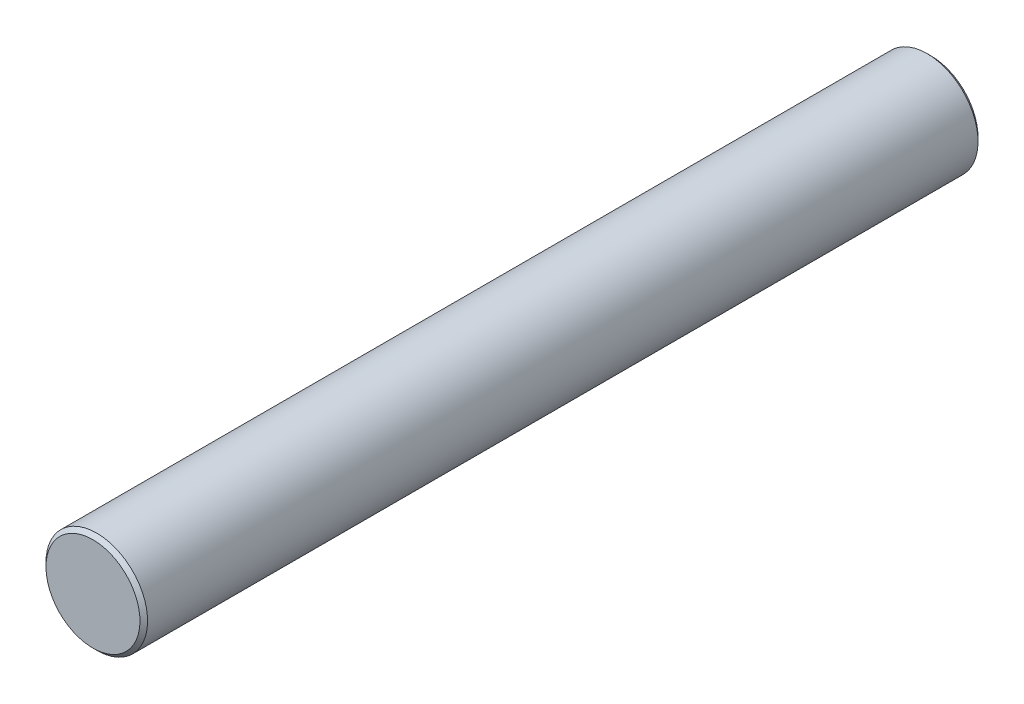
ISO-10303-21;
HEADER;
FILE_DESCRIPTION(('STEP AP214'),'2;1');
FILE_NAME('part.step','',(''),(''),'','','');
FILE_SCHEMA(('AUTOMOTIVE_DESIGN { 1 0 10303 214 1 1 1 1 }'));
ENDSEC;
DATA;
#1=APPLICATION_CONTEXT('core data for automotive mechanical design processes');
#2=APPLICATION_PROTOCOL_DEFINITION('international standard','automotive_design',2000,#1);
#3=PRODUCT_CONTEXT('',#1,'mechanical');
#4=PRODUCT('Part','Part','',(#3));
#5=PRODUCT_RELATED_PRODUCT_CATEGORY('part','',(#4));
#6=PRODUCT_DEFINITION_FORMATION('','',#4);
#7=PRODUCT_DEFINITION_CONTEXT('part definition',#1,'design');
#8=PRODUCT_DEFINITION('design','',#6,#7);
#9=PRODUCT_DEFINITION_SHAPE('','',#8);
#10=(LENGTH_UNIT() NAMED_UNIT(*) SI_UNIT(.MILLI.,.METRE.));
#11=(NAMED_UNIT(*) PLANE_ANGLE_UNIT() SI_UNIT($,.RADIAN.));
#12=(NAMED_UNIT(*) SI_UNIT($,.STERADIAN.) SOLID_ANGLE_UNIT());
#13=UNCERTAINTY_MEASURE_WITH_UNIT(LENGTH_MEASURE(1.E-05),#10,'distance_accuracy_value','');
#14=(GEOMETRIC_REPRESENTATION_CONTEXT(3) GLOBAL_UNCERTAINTY_ASSIGNED_CONTEXT((#13)) GLOBAL_UNIT_ASSIGNED_CONTEXT((#10,
#11,#12)) REPRESENTATION_CONTEXT('',''));
#15=CARTESIAN_POINT('',(0.,0.,0.));
#16=DIRECTION('',(0.,0.,1.));
#17=DIRECTION('',(1.,0.,0.));
#18=AXIS2_PLACEMENT_3D('',#15,#16,#17);
#19=CARTESIAN_POINT('',(0.,9.25,0.));
#20=DIRECTION('',(0.,0.,-1.));
#21=DIRECTION('',(0.,1.,0.));
#22=AXIS2_PLACEMENT_3D('',#19,#20,#21);
#23=PLANE('',#22);
#24=CARTESIAN_POINT('',(0.,0.,0.));
#25=DIRECTION('',(0.,0.,-1.));
#26=DIRECTION('',(0.,1.,0.));
#27=AXIS2_PLACEMENT_3D('',#24,#25,#26);
#28=CIRCLE('',#27,18.5);
#29=CARTESIAN_POINT('',(0.,18.5,0.));
#30=VERTEX_POINT('',#29);
#31=EDGE_CURVE('E9',#30,#30,#28,.T.);
#32=ORIENTED_EDGE('',*,*,#31,.T.);
#33=EDGE_LOOP('',(#32));
#34=FACE_BOUND('',#33,.T.);
#35=CARTESIAN_POINT('',(0.,0.,0.));
#36=DIRECTION('',(0.,0.,1.));
#37=DIRECTION('',(-1.,0.,0.));
#38=AXIS2_PLACEMENT_3D('',#35,#36,#37);
#39=CIRCLE('',#38,6.);
#40=CARTESIAN_POINT('',(-6.,0.,0.));
#41=VERTEX_POINT('',#40);
#42=EDGE_CURVE('E52',#41,#41,#39,.T.);
#43=ORIENTED_EDGE('',*,*,#42,.T.);
#44=EDGE_LOOP('',(#43));
#45=FACE_BOUND('',#44,.T.);
#46=ADVANCED_FACE('F15',(#34,#45),#23,.T.);
#47=CARTESIAN_POINT('',(0.,0.,0.75));
#48=DIRECTION('',(0.,0.,1.));
#49=DIRECTION('',(0.,1.,0.));
#50=AXIS2_PLACEMENT_3D('',#47,#48,#49);
#51=CONICAL_SURFACE('',#50,19.25,0.785398163397448);
#52=CARTESIAN_POINT('',(0.,0.,1.5));
#53=DIRECTION('',(0.,0.,-1.));
#54=DIRECTION('',(0.,1.,0.));
#55=AXIS2_PLACEMENT_3D('',#52,#53,#54);
#56=CIRCLE('',#55,20.);
#57=CARTESIAN_POINT('',(0.,20.,1.5));
#58=VERTEX_POINT('',#57);
#59=EDGE_CURVE('E25',#58,#58,#56,.T.);
#60=ORIENTED_EDGE('',*,*,#59,.T.);
#61=EDGE_LOOP('',(#60));
#62=FACE_BOUND('',#61,.T.);
#63=ORIENTED_EDGE('',*,*,#31,.F.);
#64=EDGE_LOOP('',(#63));
#65=FACE_BOUND('',#64,.T.);
#66=ADVANCED_FACE('F121',(#62,#65),#51,.T.);
#67=CARTESIAN_POINT('',(0.,0.,165.));
#68=DIRECTION('',(0.,0.,1.));
#69=DIRECTION('',(0.,1.,0.));
#70=AXIS2_PLACEMENT_3D('',#67,#68,#69);
#71=CYLINDRICAL_SURFACE('',#70,20.);
#72=CARTESIAN_POINT('',(0.,0.,328.5));
#73=DIRECTION('',(0.,0.,-1.));
#74=DIRECTION('',(0.,1.,0.));
#75=AXIS2_PLACEMENT_3D('',#72,#73,#74);
#76=CIRCLE('',#75,20.);
#77=CARTESIAN_POINT('',(0.,20.,328.5));
#78=VERTEX_POINT('',#77);
#79=EDGE_CURVE('E19',#78,#78,#76,.T.);
#80=ORIENTED_EDGE('',*,*,#79,.T.);
#81=EDGE_LOOP('',(#80));
#82=FACE_BOUND('',#81,.T.);
#83=ORIENTED_EDGE('',*,*,#59,.F.);
#84=EDGE_LOOP('',(#83));
#85=FACE_BOUND('',#84,.T.);
#86=CARTESIAN_POINT('',(0.,0.,6.5));
#87=DIRECTION('',(0.,0.,-1.));
#88=DIRECTION('',(0.,1.,0.));
#89=AXIS2_PLACEMENT_3D('',#86,#87,#88);
#90=CIRCLE('',#89,20.);
#91=CARTESIAN_POINT('',(10.5356537528527,-17.,6.5));
#92=VERTEX_POINT('',#91);
#93=CARTESIAN_POINT('',(-10.5356537528527,-17.,6.5));
#94=VERTEX_POINT('',#93);
#95=EDGE_CURVE('E69',#92,#94,#90,.T.);
#96=ORIENTED_EDGE('',*,*,#95,.T.);
#97=DIRECTION('',(0.,0.,1.));
#98=VECTOR('',#97,1.);
#99=CARTESIAN_POINT('',(-10.5356537528527,-17.,8.25));
#100=LINE('',#99,#98);
#101=CARTESIAN_POINT('',(-10.5356537528527,-17.,10.));
#102=VERTEX_POINT('',#101);
#103=EDGE_CURVE('E62',#94,#102,#100,.T.);
#104=ORIENTED_EDGE('',*,*,#103,.T.);
#105=CARTESIAN_POINT('',(0.,0.,10.));
#106=DIRECTION('',(0.,0.,1.));
#107=DIRECTION('',(0.,1.,0.));
#108=AXIS2_PLACEMENT_3D('',#105,#106,#107);
#109=CIRCLE('',#108,20.);
#110=CARTESIAN_POINT('',(10.5356537528527,-17.,10.));
#111=VERTEX_POINT('',#110);
#112=EDGE_CURVE('E75',#102,#111,#109,.T.);
#113=ORIENTED_EDGE('',*,*,#112,.T.);
#114=DIRECTION('',(0.,0.,-1.));
#115=VECTOR('',#114,1.);
#116=CARTESIAN_POINT('',(10.5356537528527,-17.,8.25));
#117=LINE('',#116,#115);
#118=EDGE_CURVE('E60',#111,#92,#117,.T.);
#119=ORIENTED_EDGE('',*,*,#118,.T.);
#120=EDGE_LOOP('',(#96,#104,#113,#119));
#121=FACE_BOUND('',#120,.T.);
#122=ADVANCED_FACE('F17',(#82,#85,#121),#71,.T.);
#123=CARTESIAN_POINT('',(0.,0.,329.25));
#124=DIRECTION('',(0.,0.,-1.));
#125=DIRECTION('',(0.,1.,0.));
#126=AXIS2_PLACEMENT_3D('',#123,#124,#125);
#127=CONICAL_SURFACE('',#126,19.25,0.785398163397448);
#128=CARTESIAN_POINT('',(0.,0.,330.));
#129=DIRECTION('',(0.,0.,-1.));
#130=DIRECTION('',(0.,1.,0.));
#131=AXIS2_PLACEMENT_3D('',#128,#129,#130);
#132=CIRCLE('',#131,18.5);
#133=CARTESIAN_POINT('',(0.,18.5,330.));
#134=VERTEX_POINT('',#133);
#135=EDGE_CURVE('E44',#134,#134,#132,.T.);
#136=ORIENTED_EDGE('',*,*,#135,.T.);
#137=EDGE_LOOP('',(#136));
#138=FACE_BOUND('',#137,.T.);
#139=ORIENTED_EDGE('',*,*,#79,.F.);
#140=EDGE_LOOP('',(#139));
#141=FACE_BOUND('',#140,.T.);
#142=ADVANCED_FACE('F116',(#138,#141),#127,.T.);
#143=CARTESIAN_POINT('',(0.,9.25,330.));
#144=DIRECTION('',(0.,0.,1.));
#145=DIRECTION('',(0.,-1.,0.));
#146=AXIS2_PLACEMENT_3D('',#143,#144,#145);
#147=PLANE('',#146);
#148=ORIENTED_EDGE('',*,*,#135,.F.);
#149=EDGE_LOOP('',(#148));
#150=FACE_BOUND('',#149,.T.);
#151=ADVANCED_FACE('F110',(#150),#147,.T.);
#152=CARTESIAN_POINT('',(0.,0.,26.4586213285198));
#153=DIRECTION('',(0.,0.,-1.));
#154=DIRECTION('',(-1.,0.,0.));
#155=AXIS2_PLACEMENT_3D('',#152,#153,#154);
#156=CONICAL_SURFACE('',#155,2.52640625,1.0471975511966);
#157=CARTESIAN_POINT('',(0.,0.,25.));
#158=DIRECTION('',(0.,0.,1.));
#159=DIRECTION('',(-1.,0.,0.));
#160=AXIS2_PLACEMENT_3D('',#157,#158,#159);
#161=CIRCLE('',#160,5.0528125);
#162=CARTESIAN_POINT('',(-5.0528125,0.,25.));
#163=VERTEX_POINT('',#162);
#164=EDGE_CURVE('E51',#163,#163,#161,.T.);
#165=ORIENTED_EDGE('',*,*,#164,.F.);
#166=EDGE_LOOP('',(#165));
#167=FACE_BOUND('',#166,.T.);
#168=CARTESIAN_POINT('',(0.,0.,27.9172426570397));
#169=VERTEX_POINT('',#168);
#170=VERTEX_LOOP('',#169);
#171=FACE_BOUND('',#170,.T.);
#172=ADVANCED_FACE('F104',(#167,#171),#156,.F.);
#173=CARTESIAN_POINT('',(0.,0.,12.97359375));
#174=DIRECTION('',(0.,0.,-1.));
#175=DIRECTION('',(-1.,0.,0.));
#176=AXIS2_PLACEMENT_3D('',#173,#174,#175);
#177=CYLINDRICAL_SURFACE('',#176,5.0528125);
#178=CARTESIAN_POINT('',(0.,0.,0.9471875));
#179=DIRECTION('',(0.,0.,1.));
#180=DIRECTION('',(-1.,0.,0.));
#181=AXIS2_PLACEMENT_3D('',#178,#179,#180);
#182=CIRCLE('',#181,5.0528125);
#183=CARTESIAN_POINT('',(-5.0528125,0.,0.9471875));
#184=VERTEX_POINT('',#183);
#185=EDGE_CURVE('E57',#184,#184,#182,.T.);
#186=ORIENTED_EDGE('',*,*,#185,.F.);
#187=EDGE_LOOP('',(#186));
#188=FACE_BOUND('',#187,.T.);
#189=ORIENTED_EDGE('',*,*,#164,.T.);
#190=EDGE_LOOP('',(#189));
#191=FACE_BOUND('',#190,.T.);
#192=ADVANCED_FACE('F101',(#188,#191),#177,.F.);
#193=CARTESIAN_POINT('',(0.,0.,0.47359375));
#194=DIRECTION('',(0.,0.,-1.));
#195=DIRECTION('',(-1.,0.,0.));
#196=AXIS2_PLACEMENT_3D('',#193,#194,#195);
#197=CONICAL_SURFACE('',#196,5.52640625,0.785398163397448);
#198=ORIENTED_EDGE('',*,*,#42,.F.);
#199=EDGE_LOOP('',(#198));
#200=FACE_BOUND('',#199,.T.);
#201=ORIENTED_EDGE('',*,*,#185,.T.);
#202=EDGE_LOOP('',(#201));
#203=FACE_BOUND('',#202,.T.);
#204=ADVANCED_FACE('F99',(#200,#203),#197,.F.);
#205=CARTESIAN_POINT('',(0.,-17.,8.25));
#206=DIRECTION('',(0.,-1.,0.));
#207=DIRECTION('',(0.,0.,-1.));
#208=AXIS2_PLACEMENT_3D('',#205,#206,#207);
#209=PLANE('',#208);
#210=ORIENTED_EDGE('',*,*,#103,.F.);
#211=DIRECTION('',(1.,0.,0.));
#212=VECTOR('',#211,1.);
#213=CARTESIAN_POINT('',(0.,-17.,6.5));
#214=LINE('',#213,#212);
#215=EDGE_CURVE('E66',#94,#92,#214,.T.);
#216=ORIENTED_EDGE('',*,*,#215,.T.);
#217=ORIENTED_EDGE('',*,*,#118,.F.);
#218=DIRECTION('',(-1.,0.,0.));
#219=VECTOR('',#218,1.);
#220=CARTESIAN_POINT('',(0.,-17.,10.));
#221=LINE('',#220,#219);
#222=EDGE_CURVE('E72',#111,#102,#221,.T.);
#223=ORIENTED_EDGE('',*,*,#222,.T.);
#224=EDGE_LOOP('',(#210,#216,#217,#223));
#225=FACE_BOUND('',#224,.T.);
#226=ADVANCED_FACE('F131',(#225),#209,.T.);
#227=CARTESIAN_POINT('',(0.,-19.5,6.5));
#228=DIRECTION('',(0.,0.,1.));
#229=DIRECTION('',(1.,0.,0.));
#230=AXIS2_PLACEMENT_3D('',#227,#228,#229);
#231=PLANE('',#230);
#232=ORIENTED_EDGE('',*,*,#95,.F.);
#233=ORIENTED_EDGE('',*,*,#215,.F.);
#234=EDGE_LOOP('',(#232,#233));
#235=FACE_BOUND('',#234,.T.);
#236=ADVANCED_FACE('F135',(#235),#231,.T.);
#237=CARTESIAN_POINT('',(0.,-19.5,10.));
#238=DIRECTION('',(0.,0.,1.));
#239=DIRECTION('',(1.,0.,0.));
#240=AXIS2_PLACEMENT_3D('',#237,#238,#239);
#241=PLANE('',#240);
#242=ORIENTED_EDGE('',*,*,#112,.F.);
#243=ORIENTED_EDGE('',*,*,#222,.F.);
#244=EDGE_LOOP('',(#242,#243));
#245=FACE_BOUND('',#244,.T.);
#246=ADVANCED_FACE('F87',(#245),#241,.F.);
#247=CLOSED_SHELL('',(#46,#66,#122,#142,#151,#172,#192,#204,#226,#236,#246));
#248=MANIFOLD_SOLID_BREP('B1',#247);
#249=ADVANCED_BREP_SHAPE_REPRESENTATION('',(#18,#248),#14);
#250=SHAPE_DEFINITION_REPRESENTATION(#9,#249);
ENDSEC;
END-ISO-10303-21;
